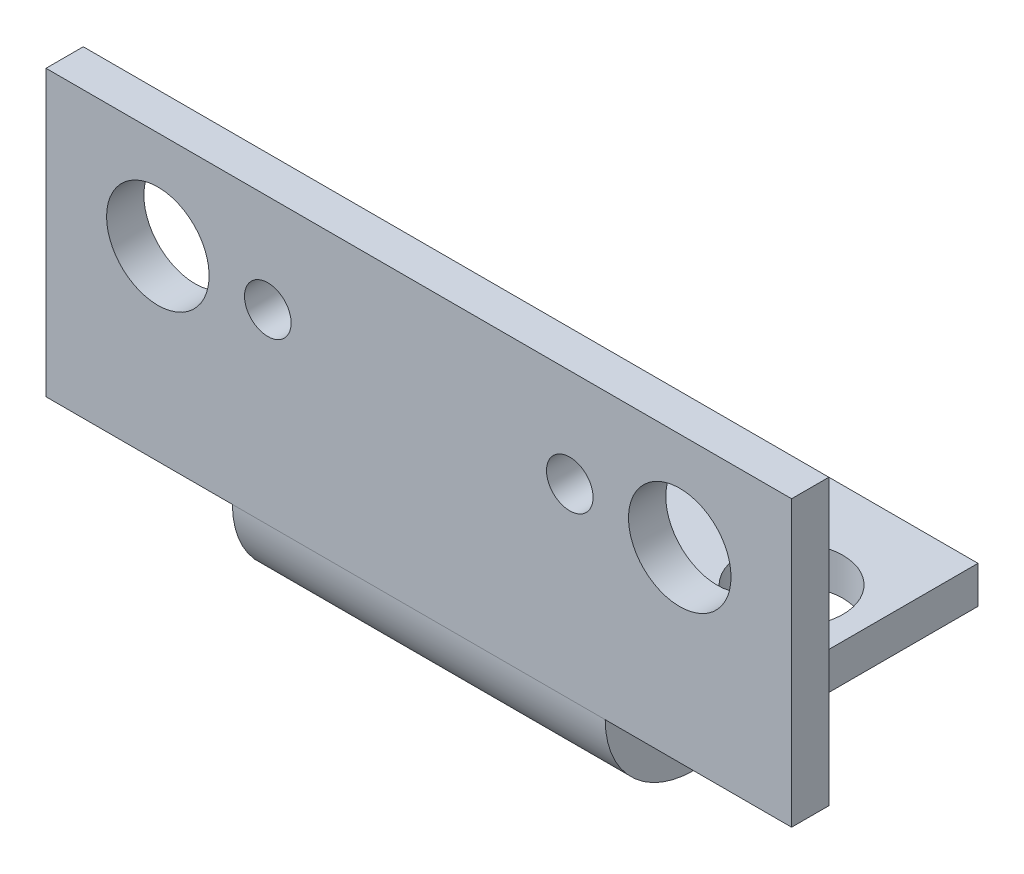
ISO-10303-21;
HEADER;
FILE_DESCRIPTION(('STEP AP214'),'2;1');
FILE_NAME('part.step','',(''),(''),'','','');
FILE_SCHEMA(('AUTOMOTIVE_DESIGN { 1 0 10303 214 1 1 1 1 }'));
ENDSEC;
DATA;
#1=APPLICATION_CONTEXT('core data for automotive mechanical design processes');
#2=APPLICATION_PROTOCOL_DEFINITION('international standard','automotive_design',2000,#1);
#3=PRODUCT_CONTEXT('',#1,'mechanical');
#4=PRODUCT('Part','Part','',(#3));
#5=PRODUCT_RELATED_PRODUCT_CATEGORY('part','',(#4));
#6=PRODUCT_DEFINITION_FORMATION('','',#4);
#7=PRODUCT_DEFINITION_CONTEXT('part definition',#1,'design');
#8=PRODUCT_DEFINITION('design','',#6,#7);
#9=PRODUCT_DEFINITION_SHAPE('','',#8);
#10=(LENGTH_UNIT() NAMED_UNIT(*) SI_UNIT(.MILLI.,.METRE.));
#11=(NAMED_UNIT(*) PLANE_ANGLE_UNIT() SI_UNIT($,.RADIAN.));
#12=(NAMED_UNIT(*) SI_UNIT($,.STERADIAN.) SOLID_ANGLE_UNIT());
#13=UNCERTAINTY_MEASURE_WITH_UNIT(LENGTH_MEASURE(1.E-05),#10,'distance_accuracy_value','');
#14=(GEOMETRIC_REPRESENTATION_CONTEXT(3) GLOBAL_UNCERTAINTY_ASSIGNED_CONTEXT((#13)) GLOBAL_UNIT_ASSIGNED_CONTEXT((#10,
#11,#12)) REPRESENTATION_CONTEXT('',''));
#15=CARTESIAN_POINT('',(0.,0.,0.));
#16=DIRECTION('',(0.,0.,1.));
#17=DIRECTION('',(1.,0.,0.));
#18=AXIS2_PLACEMENT_3D('',#15,#16,#17);
#19=CARTESIAN_POINT('',(10.,-2.,10.));
#20=DIRECTION('',(1.,0.,0.));
#21=DIRECTION('',(0.,0.,-1.));
#22=AXIS2_PLACEMENT_3D('',#19,#20,#21);
#23=PLANE('',#22);
#24=DIRECTION('',(0.,0.,-1.));
#25=VECTOR('',#24,1.);
#26=CARTESIAN_POINT('',(10.,0.,10.));
#27=LINE('',#26,#25);
#28=CARTESIAN_POINT('',(10.,0.,5.26340000000001));
#29=VERTEX_POINT('',#28);
#30=CARTESIAN_POINT('',(10.,0.,-10.));
#31=VERTEX_POINT('',#30);
#32=EDGE_CURVE('E111',#29,#31,#27,.T.);
#33=ORIENTED_EDGE('',*,*,#32,.F.);
#34=DIRECTION('',(0.,-1.,0.));
#35=VECTOR('',#34,1.);
#36=CARTESIAN_POINT('',(10.,0.,5.26340000000001));
#37=LINE('',#36,#35);
#38=CARTESIAN_POINT('',(10.,-2.00000000000001,5.26340000000001));
#39=VERTEX_POINT('',#38);
#40=EDGE_CURVE('E200',#29,#39,#37,.T.);
#41=ORIENTED_EDGE('',*,*,#40,.T.);
#42=DIRECTION('',(0.,0.,-1.));
#43=VECTOR('',#42,1.);
#44=CARTESIAN_POINT('',(10.,-2.,10.));
#45=LINE('',#44,#43);
#46=CARTESIAN_POINT('',(10.,-2.,-10.));
#47=VERTEX_POINT('',#46);
#48=EDGE_CURVE('E107',#39,#47,#45,.T.);
#49=ORIENTED_EDGE('',*,*,#48,.T.);
#50=DIRECTION('',(0.,1.,0.));
#51=VECTOR('',#50,1.);
#52=CARTESIAN_POINT('',(10.,-2.,-10.));
#53=LINE('',#52,#51);
#54=EDGE_CURVE('E65',#47,#31,#53,.T.);
#55=ORIENTED_EDGE('',*,*,#54,.T.);
#56=EDGE_LOOP('',(#33,#41,#49,#55));
#57=FACE_BOUND('',#56,.T.);
#58=ADVANCED_FACE('F57',(#57),#23,.T.);
#59=CARTESIAN_POINT('',(0.,-2.,0.));
#60=DIRECTION('',(0.,-1.,0.));
#61=DIRECTION('',(0.,0.,-1.));
#62=AXIS2_PLACEMENT_3D('',#59,#60,#61);
#63=PLANE('',#62);
#64=CARTESIAN_POINT('',(-6.,-2.,-4.));
#65=DIRECTION('',(0.,-1.,0.));
#66=DIRECTION('',(0.,0.,-1.));
#67=AXIS2_PLACEMENT_3D('',#64,#65,#66);
#68=CIRCLE('',#67,2.75);
#69=CARTESIAN_POINT('',(-6.,-2.,-6.75));
#70=VERTEX_POINT('',#69);
#71=EDGE_CURVE('E148',#70,#70,#68,.T.);
#72=ORIENTED_EDGE('',*,*,#71,.F.);
#73=EDGE_LOOP('',(#72));
#74=FACE_BOUND('',#73,.T.);
#75=CARTESIAN_POINT('',(6.,-2.,-4.));
#76=DIRECTION('',(0.,-1.,0.));
#77=DIRECTION('',(0.,0.,-1.));
#78=AXIS2_PLACEMENT_3D('',#75,#76,#77);
#79=CIRCLE('',#78,2.75);
#80=CARTESIAN_POINT('',(6.,-2.,-6.75));
#81=VERTEX_POINT('',#80);
#82=EDGE_CURVE('E137',#81,#81,#79,.T.);
#83=ORIENTED_EDGE('',*,*,#82,.F.);
#84=EDGE_LOOP('',(#83));
#85=FACE_BOUND('',#84,.T.);
#86=ORIENTED_EDGE('',*,*,#48,.F.);
#87=DIRECTION('',(1.,0.,0.));
#88=VECTOR('',#87,1.);
#89=CARTESIAN_POINT('',(10.,-2.00000000000001,5.26340000000001));
#90=LINE('',#89,#88);
#91=CARTESIAN_POINT('',(-9.99999999999999,-2.,5.26340000000001));
#92=VERTEX_POINT('',#91);
#93=EDGE_CURVE('E195',#39,#92,#90,.F.);
#94=ORIENTED_EDGE('',*,*,#93,.T.);
#95=DIRECTION('',(0.,0.,1.));
#96=VECTOR('',#95,1.);
#97=CARTESIAN_POINT('',(-9.99999999999999,-2.,10.));
#98=LINE('',#97,#96);
#99=CARTESIAN_POINT('',(-9.99999999999999,-2.,-10.));
#100=VERTEX_POINT('',#99);
#101=EDGE_CURVE('E119',#100,#92,#98,.T.);
#102=ORIENTED_EDGE('',*,*,#101,.F.);
#103=DIRECTION('',(-1.,0.,0.));
#104=VECTOR('',#103,1.);
#105=CARTESIAN_POINT('',(-9.99999999999999,-2.,-10.));
#106=LINE('',#105,#104);
#107=EDGE_CURVE('E98',#47,#100,#106,.T.);
#108=ORIENTED_EDGE('',*,*,#107,.F.);
#109=EDGE_LOOP('',(#86,#94,#102,#108));
#110=FACE_BOUND('',#109,.T.);
#111=ADVANCED_FACE('F228',(#74,#85,#110),#63,.T.);
#112=CARTESIAN_POINT('',(0.,0.,0.));
#113=DIRECTION('',(0.,-1.,0.));
#114=DIRECTION('',(0.,0.,-1.));
#115=AXIS2_PLACEMENT_3D('',#112,#113,#114);
#116=PLANE('',#115);
#117=CARTESIAN_POINT('',(-6.,0.,-4.));
#118=DIRECTION('',(0.,-1.,0.));
#119=DIRECTION('',(0.,0.,-1.));
#120=AXIS2_PLACEMENT_3D('',#117,#118,#119);
#121=CIRCLE('',#120,2.75);
#122=CARTESIAN_POINT('',(-6.,0.,-6.75));
#123=VERTEX_POINT('',#122);
#124=EDGE_CURVE('E60',#123,#123,#121,.T.);
#125=ORIENTED_EDGE('',*,*,#124,.T.);
#126=EDGE_LOOP('',(#125));
#127=FACE_BOUND('',#126,.T.);
#128=CARTESIAN_POINT('',(6.,0.,-4.));
#129=DIRECTION('',(0.,-1.,0.));
#130=DIRECTION('',(0.,0.,-1.));
#131=AXIS2_PLACEMENT_3D('',#128,#129,#130);
#132=CIRCLE('',#131,2.75);
#133=CARTESIAN_POINT('',(6.,0.,-6.75));
#134=VERTEX_POINT('',#133);
#135=EDGE_CURVE('E134',#134,#134,#132,.T.);
#136=ORIENTED_EDGE('',*,*,#135,.T.);
#137=EDGE_LOOP('',(#136));
#138=FACE_BOUND('',#137,.T.);
#139=DIRECTION('',(1.,0.,0.));
#140=VECTOR('',#139,1.);
#141=CARTESIAN_POINT('',(10.,0.,5.26340000000001));
#142=LINE('',#141,#140);
#143=CARTESIAN_POINT('',(-10.,0.,5.26340000000001));
#144=VERTEX_POINT('',#143);
#145=EDGE_CURVE('E209',#29,#144,#142,.F.);
#146=ORIENTED_EDGE('',*,*,#145,.F.);
#147=ORIENTED_EDGE('',*,*,#32,.T.);
#148=DIRECTION('',(-1.,0.,0.));
#149=VECTOR('',#148,1.);
#150=CARTESIAN_POINT('',(-9.99999999999999,0.,-10.));
#151=LINE('',#150,#149);
#152=CARTESIAN_POINT('',(-9.99999999999999,0.,-10.));
#153=VERTEX_POINT('',#152);
#154=EDGE_CURVE('E96',#31,#153,#151,.T.);
#155=ORIENTED_EDGE('',*,*,#154,.T.);
#156=DIRECTION('',(0.,0.,1.));
#157=VECTOR('',#156,1.);
#158=CARTESIAN_POINT('',(-9.99999999999999,0.,10.));
#159=LINE('',#158,#157);
#160=EDGE_CURVE('E101',#153,#144,#159,.T.);
#161=ORIENTED_EDGE('',*,*,#160,.T.);
#162=EDGE_LOOP('',(#146,#147,#155,#161));
#163=FACE_BOUND('',#162,.T.);
#164=ADVANCED_FACE('F109',(#127,#138,#163),#116,.F.);
#165=CARTESIAN_POINT('',(-9.99999999999999,-2.,10.));
#166=DIRECTION('',(-1.,0.,0.));
#167=DIRECTION('',(0.,0.,1.));
#168=AXIS2_PLACEMENT_3D('',#165,#166,#167);
#169=PLANE('',#168);
#170=DIRECTION('',(0.,-1.,0.));
#171=VECTOR('',#170,1.);
#172=CARTESIAN_POINT('',(-10.,0.,5.26340000000001));
#173=LINE('',#172,#171);
#174=EDGE_CURVE('E104',#144,#92,#173,.T.);
#175=ORIENTED_EDGE('',*,*,#174,.F.);
#176=ORIENTED_EDGE('',*,*,#160,.F.);
#177=DIRECTION('',(0.,1.,0.));
#178=VECTOR('',#177,1.);
#179=CARTESIAN_POINT('',(-9.99999999999999,-2.,-10.));
#180=LINE('',#179,#178);
#181=EDGE_CURVE('E13',#100,#153,#180,.T.);
#182=ORIENTED_EDGE('',*,*,#181,.F.);
#183=ORIENTED_EDGE('',*,*,#101,.T.);
#184=EDGE_LOOP('',(#175,#176,#182,#183));
#185=FACE_BOUND('',#184,.T.);
#186=ADVANCED_FACE('F102',(#185),#169,.T.);
#187=CARTESIAN_POINT('',(-9.99999999999999,-2.,-10.));
#188=DIRECTION('',(0.,0.,-1.));
#189=DIRECTION('',(-1.,0.,0.));
#190=AXIS2_PLACEMENT_3D('',#187,#188,#189);
#191=PLANE('',#190);
#192=ORIENTED_EDGE('',*,*,#154,.F.);
#193=ORIENTED_EDGE('',*,*,#54,.F.);
#194=ORIENTED_EDGE('',*,*,#107,.T.);
#195=ORIENTED_EDGE('',*,*,#181,.T.);
#196=EDGE_LOOP('',(#192,#193,#194,#195));
#197=FACE_BOUND('',#196,.T.);
#198=ADVANCED_FACE('F93',(#197),#191,.T.);
#199=CARTESIAN_POINT('',(-10.,2.73659999999999,5.26340000000001));
#200=DIRECTION('',(-1.,0.,0.));
#201=DIRECTION('',(0.,-1.,0.));
#202=AXIS2_PLACEMENT_3D('',#199,#200,#201);
#203=PLANE('',#202);
#204=DIRECTION('',(0.,0.,1.));
#205=VECTOR('',#204,1.);
#206=CARTESIAN_POINT('',(-10.,2.73659999999998,8.00000000000001));
#207=LINE('',#206,#205);
#208=CARTESIAN_POINT('',(-10.,2.73659999999998,8.00000000000001));
#209=VERTEX_POINT('',#208);
#210=CARTESIAN_POINT('',(-10.,2.73659999999999,10.));
#211=VERTEX_POINT('',#210);
#212=EDGE_CURVE('E218',#209,#211,#207,.T.);
#213=ORIENTED_EDGE('',*,*,#212,.F.);
#214=CARTESIAN_POINT('',(-10.,2.73659999999999,5.26340000000001));
#215=DIRECTION('',(1.,0.,0.));
#216=DIRECTION('',(0.,1.,0.));
#217=AXIS2_PLACEMENT_3D('',#214,#215,#216);
#218=CIRCLE('',#217,2.7366);
#219=EDGE_CURVE('E204',#144,#209,#218,.F.);
#220=ORIENTED_EDGE('',*,*,#219,.F.);
#221=ORIENTED_EDGE('',*,*,#174,.T.);
#222=CARTESIAN_POINT('',(-10.,2.73659999999999,5.26340000000001));
#223=DIRECTION('',(1.,0.,0.));
#224=DIRECTION('',(0.,1.,0.));
#225=AXIS2_PLACEMENT_3D('',#222,#223,#224);
#226=CIRCLE('',#225,4.7366);
#227=EDGE_CURVE('E73',#92,#211,#226,.F.);
#228=ORIENTED_EDGE('',*,*,#227,.T.);
#229=EDGE_LOOP('',(#213,#220,#221,#228));
#230=FACE_BOUND('',#229,.T.);
#231=ADVANCED_FACE('F327',(#230),#203,.T.);
#232=CARTESIAN_POINT('',(10.,2.73659999999999,5.26340000000001));
#233=DIRECTION('',(-1.,0.,0.));
#234=DIRECTION('',(0.,-1.,0.));
#235=AXIS2_PLACEMENT_3D('',#232,#233,#234);
#236=PLANE('',#235);
#237=CARTESIAN_POINT('',(10.,2.73659999999999,5.26340000000001));
#238=DIRECTION('',(1.,0.,0.));
#239=DIRECTION('',(0.,1.,0.));
#240=AXIS2_PLACEMENT_3D('',#237,#238,#239);
#241=CIRCLE('',#240,2.7366);
#242=CARTESIAN_POINT('',(10.,2.73659999999998,8.00000000000001));
#243=VERTEX_POINT('',#242);
#244=EDGE_CURVE('E212',#243,#29,#241,.T.);
#245=ORIENTED_EDGE('',*,*,#244,.F.);
#246=DIRECTION('',(0.,0.,1.));
#247=VECTOR('',#246,1.);
#248=CARTESIAN_POINT('',(10.,2.73659999999998,8.00000000000001));
#249=LINE('',#248,#247);
#250=CARTESIAN_POINT('',(10.,2.73659999999997,10.));
#251=VERTEX_POINT('',#250);
#252=EDGE_CURVE('E114',#243,#251,#249,.T.);
#253=ORIENTED_EDGE('',*,*,#252,.T.);
#254=CARTESIAN_POINT('',(10.,2.73659999999999,5.26340000000001));
#255=DIRECTION('',(1.,0.,0.));
#256=DIRECTION('',(0.,1.,0.));
#257=AXIS2_PLACEMENT_3D('',#254,#255,#256);
#258=CIRCLE('',#257,4.7366);
#259=EDGE_CURVE('E198',#251,#39,#258,.T.);
#260=ORIENTED_EDGE('',*,*,#259,.T.);
#261=ORIENTED_EDGE('',*,*,#40,.F.);
#262=EDGE_LOOP('',(#245,#253,#260,#261));
#263=FACE_BOUND('',#262,.T.);
#264=ADVANCED_FACE('F237',(#263),#236,.F.);
#265=CARTESIAN_POINT('',(10.,2.73659999999999,5.26340000000001));
#266=DIRECTION('',(1.,0.,0.));
#267=DIRECTION('',(0.,0.,1.));
#268=AXIS2_PLACEMENT_3D('',#265,#266,#267);
#269=CYLINDRICAL_SURFACE('',#268,4.7366);
#270=ORIENTED_EDGE('',*,*,#93,.F.);
#271=ORIENTED_EDGE('',*,*,#259,.F.);
#272=DIRECTION('',(1.,0.,0.));
#273=VECTOR('',#272,1.);
#274=CARTESIAN_POINT('',(10.,2.73659999999997,10.));
#275=LINE('',#274,#273);
#276=EDGE_CURVE('E201',#211,#251,#275,.T.);
#277=ORIENTED_EDGE('',*,*,#276,.F.);
#278=ORIENTED_EDGE('',*,*,#227,.F.);
#279=EDGE_LOOP('',(#270,#271,#277,#278));
#280=FACE_BOUND('',#279,.T.);
#281=ADVANCED_FACE('F230',(#280),#269,.T.);
#282=CARTESIAN_POINT('',(10.,2.73659999999999,5.26340000000001));
#283=DIRECTION('',(1.,0.,0.));
#284=DIRECTION('',(0.,0.,1.));
#285=AXIS2_PLACEMENT_3D('',#282,#283,#284);
#286=CYLINDRICAL_SURFACE('',#285,2.7366);
#287=ORIENTED_EDGE('',*,*,#145,.T.);
#288=ORIENTED_EDGE('',*,*,#219,.T.);
#289=DIRECTION('',(1.,0.,0.));
#290=VECTOR('',#289,1.);
#291=CARTESIAN_POINT('',(10.,2.73659999999998,8.00000000000001));
#292=LINE('',#291,#290);
#293=EDGE_CURVE('E160',#209,#243,#292,.T.);
#294=ORIENTED_EDGE('',*,*,#293,.T.);
#295=ORIENTED_EDGE('',*,*,#244,.T.);
#296=EDGE_LOOP('',(#287,#288,#294,#295));
#297=FACE_BOUND('',#296,.T.);
#298=ADVANCED_FACE('F335',(#297),#286,.F.);
#299=CARTESIAN_POINT('',(-20.,2.73659999999999,8.00000000000001));
#300=DIRECTION('',(0.,-1.,0.));
#301=DIRECTION('',(1.,0.,0.));
#302=AXIS2_PLACEMENT_3D('',#299,#300,#301);
#303=PLANE('',#302);
#304=ORIENTED_EDGE('',*,*,#252,.F.);
#305=DIRECTION('',(-1.,0.,0.));
#306=VECTOR('',#305,1.);
#307=CARTESIAN_POINT('',(-20.,2.73659999999999,8.00000000000001));
#308=LINE('',#307,#306);
#309=CARTESIAN_POINT('',(20.,2.73659999999999,8.00000000000001));
#310=VERTEX_POINT('',#309);
#311=EDGE_CURVE('E192',#243,#310,#308,.F.);
#312=ORIENTED_EDGE('',*,*,#311,.T.);
#313=DIRECTION('',(0.,0.,1.));
#314=VECTOR('',#313,1.);
#315=CARTESIAN_POINT('',(20.,2.73659999999999,8.00000000000001));
#316=LINE('',#315,#314);
#317=CARTESIAN_POINT('',(20.,2.73659999999999,10.));
#318=VERTEX_POINT('',#317);
#319=EDGE_CURVE('E186',#310,#318,#316,.T.);
#320=ORIENTED_EDGE('',*,*,#319,.T.);
#321=DIRECTION('',(1.,0.,0.));
#322=VECTOR('',#321,1.);
#323=CARTESIAN_POINT('',(0.,2.73659999999999,10.));
#324=LINE('',#323,#322);
#325=EDGE_CURVE('E185',#251,#318,#324,.T.);
#326=ORIENTED_EDGE('',*,*,#325,.F.);
#327=EDGE_LOOP('',(#304,#312,#320,#326));
#328=FACE_BOUND('',#327,.T.);
#329=ADVANCED_FACE('F282',(#328),#303,.T.);
#330=CARTESIAN_POINT('',(20.,0.,10.));
#331=DIRECTION('',(1.,0.,0.));
#332=DIRECTION('',(0.,0.,-1.));
#333=AXIS2_PLACEMENT_3D('',#330,#331,#332);
#334=PLANE('',#333);
#335=DIRECTION('',(0.,-1.,0.));
#336=VECTOR('',#335,1.);
#337=CARTESIAN_POINT('',(20.,0.,10.));
#338=LINE('',#337,#336);
#339=CARTESIAN_POINT('',(20.,18.,10.0000000000001));
#340=VERTEX_POINT('',#339);
#341=EDGE_CURVE('E164',#340,#318,#338,.T.);
#342=ORIENTED_EDGE('',*,*,#341,.T.);
#343=ORIENTED_EDGE('',*,*,#319,.F.);
#344=DIRECTION('',(0.,1.,0.));
#345=VECTOR('',#344,1.);
#346=CARTESIAN_POINT('',(20.,0.,8.));
#347=LINE('',#346,#345);
#348=CARTESIAN_POINT('',(20.,18.,8.00000000000006));
#349=VERTEX_POINT('',#348);
#350=EDGE_CURVE('E173',#349,#310,#347,.F.);
#351=ORIENTED_EDGE('',*,*,#350,.F.);
#352=DIRECTION('',(0.,0.,-1.));
#353=VECTOR('',#352,1.);
#354=CARTESIAN_POINT('',(20.,18.,10.0000000000001));
#355=LINE('',#354,#353);
#356=EDGE_CURVE('E157',#340,#349,#355,.T.);
#357=ORIENTED_EDGE('',*,*,#356,.F.);
#358=EDGE_LOOP('',(#342,#343,#351,#357));
#359=FACE_BOUND('',#358,.T.);
#360=ADVANCED_FACE('F280',(#359),#334,.T.);
#361=CARTESIAN_POINT('',(-20.,18.,10.0000000000001));
#362=DIRECTION('',(-1.,0.,0.));
#363=DIRECTION('',(0.,-1.,0.));
#364=AXIS2_PLACEMENT_3D('',#361,#362,#363);
#365=PLANE('',#364);
#366=DIRECTION('',(0.,-1.,0.));
#367=VECTOR('',#366,1.);
#368=CARTESIAN_POINT('',(-20.,0.,8.));
#369=LINE('',#368,#367);
#370=CARTESIAN_POINT('',(-20.,2.73659999999999,8.00000000000001));
#371=VERTEX_POINT('',#370);
#372=CARTESIAN_POINT('',(-20.,18.,8.00000000000006));
#373=VERTEX_POINT('',#372);
#374=EDGE_CURVE('E179',#371,#373,#369,.F.);
#375=ORIENTED_EDGE('',*,*,#374,.F.);
#376=DIRECTION('',(0.,0.,1.));
#377=VECTOR('',#376,1.);
#378=CARTESIAN_POINT('',(-20.,2.73659999999999,10.0000000000001));
#379=LINE('',#378,#377);
#380=CARTESIAN_POINT('',(-20.,2.73659999999999,10.));
#381=VERTEX_POINT('',#380);
#382=EDGE_CURVE('E123',#371,#381,#379,.T.);
#383=ORIENTED_EDGE('',*,*,#382,.T.);
#384=DIRECTION('',(0.,1.,0.));
#385=VECTOR('',#384,1.);
#386=CARTESIAN_POINT('',(-20.,18.,10.0000000000001));
#387=LINE('',#386,#385);
#388=CARTESIAN_POINT('',(-20.,18.,10.0000000000001));
#389=VERTEX_POINT('',#388);
#390=EDGE_CURVE('E170',#381,#389,#387,.T.);
#391=ORIENTED_EDGE('',*,*,#390,.T.);
#392=DIRECTION('',(0.,0.,-1.));
#393=VECTOR('',#392,1.);
#394=CARTESIAN_POINT('',(-20.,18.,10.0000000000001));
#395=LINE('',#394,#393);
#396=EDGE_CURVE('E161',#389,#373,#395,.T.);
#397=ORIENTED_EDGE('',*,*,#396,.T.);
#398=EDGE_LOOP('',(#375,#383,#391,#397));
#399=FACE_BOUND('',#398,.T.);
#400=ADVANCED_FACE('F297',(#399),#365,.T.);
#401=CARTESIAN_POINT('',(0.,0.,10.));
#402=DIRECTION('',(0.,0.,1.));
#403=DIRECTION('',(0.,-1.,0.));
#404=AXIS2_PLACEMENT_3D('',#401,#402,#403);
#405=PLANE('',#404);
#406=CARTESIAN_POINT('',(8.1,12.7366,10.));
#407=DIRECTION('',(0.,0.,1.));
#408=DIRECTION('',(1.,0.,0.));
#409=AXIS2_PLACEMENT_3D('',#406,#407,#408);
#410=CIRCLE('',#409,1.25);
#411=CARTESIAN_POINT('',(9.35,12.7366,10.));
#412=VERTEX_POINT('',#411);
#413=EDGE_CURVE('E129',#412,#412,#410,.T.);
#414=ORIENTED_EDGE('',*,*,#413,.F.);
#415=EDGE_LOOP('',(#414));
#416=FACE_BOUND('',#415,.T.);
#417=CARTESIAN_POINT('',(-8.1,12.7366,10.));
#418=DIRECTION('',(0.,0.,1.));
#419=DIRECTION('',(-1.,0.,0.));
#420=AXIS2_PLACEMENT_3D('',#417,#418,#419);
#421=CIRCLE('',#420,1.25);
#422=CARTESIAN_POINT('',(-9.35,12.7366,10.));
#423=VERTEX_POINT('',#422);
#424=EDGE_CURVE('E141',#423,#423,#421,.T.);
#425=ORIENTED_EDGE('',*,*,#424,.F.);
#426=EDGE_LOOP('',(#425));
#427=FACE_BOUND('',#426,.T.);
#428=CARTESIAN_POINT('',(-14.,12.7366,10.));
#429=DIRECTION('',(0.,0.,1.));
#430=DIRECTION('',(-1.,0.,0.));
#431=AXIS2_PLACEMENT_3D('',#428,#429,#430);
#432=CIRCLE('',#431,2.75);
#433=CARTESIAN_POINT('',(-16.75,12.7366,10.));
#434=VERTEX_POINT('',#433);
#435=EDGE_CURVE('E136',#434,#434,#432,.T.);
#436=ORIENTED_EDGE('',*,*,#435,.F.);
#437=EDGE_LOOP('',(#436));
#438=FACE_BOUND('',#437,.T.);
#439=CARTESIAN_POINT('',(14.,12.7366,10.));
#440=DIRECTION('',(0.,0.,1.));
#441=DIRECTION('',(1.,0.,0.));
#442=AXIS2_PLACEMENT_3D('',#439,#440,#441);
#443=CIRCLE('',#442,2.75);
#444=CARTESIAN_POINT('',(16.75,12.7366,10.));
#445=VERTEX_POINT('',#444);
#446=EDGE_CURVE('E124',#445,#445,#443,.T.);
#447=ORIENTED_EDGE('',*,*,#446,.F.);
#448=EDGE_LOOP('',(#447));
#449=FACE_BOUND('',#448,.T.);
#450=ORIENTED_EDGE('',*,*,#390,.F.);
#451=EDGE_CURVE('E182',#381,#211,#324,.T.);
#452=ORIENTED_EDGE('',*,*,#451,.T.);
#453=ORIENTED_EDGE('',*,*,#276,.T.);
#454=ORIENTED_EDGE('',*,*,#325,.T.);
#455=ORIENTED_EDGE('',*,*,#341,.F.);
#456=DIRECTION('',(1.,0.,0.));
#457=VECTOR('',#456,1.);
#458=CARTESIAN_POINT('',(20.,18.,10.0000000000001));
#459=LINE('',#458,#457);
#460=EDGE_CURVE('E167',#389,#340,#459,.T.);
#461=ORIENTED_EDGE('',*,*,#460,.F.);
#462=EDGE_LOOP('',(#450,#452,#453,#454,#455,#461));
#463=FACE_BOUND('',#462,.T.);
#464=ADVANCED_FACE('F275',(#416,#427,#438,#449,#463),#405,.T.);
#465=CARTESIAN_POINT('',(0.,0.,8.));
#466=DIRECTION('',(0.,0.,1.));
#467=DIRECTION('',(0.,-1.,0.));
#468=AXIS2_PLACEMENT_3D('',#465,#466,#467);
#469=PLANE('',#468);
#470=CARTESIAN_POINT('',(8.1,12.7366,8.00000000000004));
#471=DIRECTION('',(0.,0.,1.));
#472=DIRECTION('',(0.,-1.,0.));
#473=AXIS2_PLACEMENT_3D('',#470,#471,#472);
#474=CIRCLE('',#473,1.25);
#475=CARTESIAN_POINT('',(8.1,11.4866,8.00000000000004));
#476=VERTEX_POINT('',#475);
#477=EDGE_CURVE('E132',#476,#476,#474,.T.);
#478=ORIENTED_EDGE('',*,*,#477,.T.);
#479=EDGE_LOOP('',(#478));
#480=FACE_BOUND('',#479,.T.);
#481=CARTESIAN_POINT('',(-8.1,12.7366,8.00000000000004));
#482=DIRECTION('',(0.,0.,1.));
#483=DIRECTION('',(0.,-1.,0.));
#484=AXIS2_PLACEMENT_3D('',#481,#482,#483);
#485=CIRCLE('',#484,1.25);
#486=CARTESIAN_POINT('',(-8.1,11.4866,8.00000000000004));
#487=VERTEX_POINT('',#486);
#488=EDGE_CURVE('E128',#487,#487,#485,.T.);
#489=ORIENTED_EDGE('',*,*,#488,.T.);
#490=EDGE_LOOP('',(#489));
#491=FACE_BOUND('',#490,.T.);
#492=CARTESIAN_POINT('',(-14.,12.7366,8.00000000000004));
#493=DIRECTION('',(0.,0.,1.));
#494=DIRECTION('',(0.,-1.,0.));
#495=AXIS2_PLACEMENT_3D('',#492,#493,#494);
#496=CIRCLE('',#495,2.75);
#497=CARTESIAN_POINT('',(-14.,9.98659999999998,8.00000000000004));
#498=VERTEX_POINT('',#497);
#499=EDGE_CURVE('E125',#498,#498,#496,.T.);
#500=ORIENTED_EDGE('',*,*,#499,.T.);
#501=EDGE_LOOP('',(#500));
#502=FACE_BOUND('',#501,.T.);
#503=CARTESIAN_POINT('',(14.,12.7366,8.00000000000004));
#504=DIRECTION('',(0.,0.,1.));
#505=DIRECTION('',(0.,-1.,0.));
#506=AXIS2_PLACEMENT_3D('',#503,#504,#505);
#507=CIRCLE('',#506,2.75);
#508=CARTESIAN_POINT('',(14.,9.98659999999998,8.00000000000004));
#509=VERTEX_POINT('',#508);
#510=EDGE_CURVE('E120',#509,#509,#507,.T.);
#511=ORIENTED_EDGE('',*,*,#510,.T.);
#512=EDGE_LOOP('',(#511));
#513=FACE_BOUND('',#512,.T.);
#514=EDGE_CURVE('E189',#371,#209,#308,.F.);
#515=ORIENTED_EDGE('',*,*,#514,.F.);
#516=ORIENTED_EDGE('',*,*,#374,.T.);
#517=DIRECTION('',(-1.,0.,0.));
#518=VECTOR('',#517,1.);
#519=CARTESIAN_POINT('',(0.,18.,8.00000000000006));
#520=LINE('',#519,#518);
#521=EDGE_CURVE('E176',#373,#349,#520,.F.);
#522=ORIENTED_EDGE('',*,*,#521,.T.);
#523=ORIENTED_EDGE('',*,*,#350,.T.);
#524=ORIENTED_EDGE('',*,*,#311,.F.);
#525=ORIENTED_EDGE('',*,*,#293,.F.);
#526=EDGE_LOOP('',(#515,#516,#522,#523,#524,#525));
#527=FACE_BOUND('',#526,.T.);
#528=ADVANCED_FACE('F286',(#480,#491,#502,#513,#527),#469,.F.);
#529=CARTESIAN_POINT('',(20.,18.,10.0000000000001));
#530=DIRECTION('',(0.,1.,0.));
#531=DIRECTION('',(0.,0.,1.));
#532=AXIS2_PLACEMENT_3D('',#529,#530,#531);
#533=PLANE('',#532);
#534=ORIENTED_EDGE('',*,*,#521,.F.);
#535=ORIENTED_EDGE('',*,*,#396,.F.);
#536=ORIENTED_EDGE('',*,*,#460,.T.);
#537=ORIENTED_EDGE('',*,*,#356,.T.);
#538=EDGE_LOOP('',(#534,#535,#536,#537));
#539=FACE_BOUND('',#538,.T.);
#540=ADVANCED_FACE('F291',(#539),#533,.T.);
#541=ORIENTED_EDGE('',*,*,#514,.T.);
#542=ORIENTED_EDGE('',*,*,#212,.T.);
#543=ORIENTED_EDGE('',*,*,#451,.F.);
#544=ORIENTED_EDGE('',*,*,#382,.F.);
#545=EDGE_LOOP('',(#541,#542,#543,#544));
#546=FACE_BOUND('',#545,.T.);
#547=ADVANCED_FACE('F296',(#546),#303,.T.);
#548=CARTESIAN_POINT('',(14.,12.7366,0.));
#549=DIRECTION('',(0.,0.,1.));
#550=DIRECTION('',(1.,0.,0.));
#551=AXIS2_PLACEMENT_3D('',#548,#549,#550);
#552=CYLINDRICAL_SURFACE('',#551,2.75);
#553=ORIENTED_EDGE('',*,*,#446,.T.);
#554=EDGE_LOOP('',(#553));
#555=FACE_BOUND('',#554,.T.);
#556=ORIENTED_EDGE('',*,*,#510,.F.);
#557=EDGE_LOOP('',(#556));
#558=FACE_BOUND('',#557,.T.);
#559=ADVANCED_FACE('F383',(#555,#558),#552,.F.);
#560=CARTESIAN_POINT('',(-14.,12.7366,0.));
#561=DIRECTION('',(0.,0.,1.));
#562=DIRECTION('',(1.,0.,0.));
#563=AXIS2_PLACEMENT_3D('',#560,#561,#562);
#564=CYLINDRICAL_SURFACE('',#563,2.75);
#565=ORIENTED_EDGE('',*,*,#435,.T.);
#566=EDGE_LOOP('',(#565));
#567=FACE_BOUND('',#566,.T.);
#568=ORIENTED_EDGE('',*,*,#499,.F.);
#569=EDGE_LOOP('',(#568));
#570=FACE_BOUND('',#569,.T.);
#571=ADVANCED_FACE('F406',(#567,#570),#564,.F.);
#572=CARTESIAN_POINT('',(-8.1,12.7366,0.));
#573=DIRECTION('',(0.,0.,1.));
#574=DIRECTION('',(1.,0.,0.));
#575=AXIS2_PLACEMENT_3D('',#572,#573,#574);
#576=CYLINDRICAL_SURFACE('',#575,1.25);
#577=ORIENTED_EDGE('',*,*,#424,.T.);
#578=EDGE_LOOP('',(#577));
#579=FACE_BOUND('',#578,.T.);
#580=ORIENTED_EDGE('',*,*,#488,.F.);
#581=EDGE_LOOP('',(#580));
#582=FACE_BOUND('',#581,.T.);
#583=ADVANCED_FACE('F417',(#579,#582),#576,.F.);
#584=CARTESIAN_POINT('',(8.1,12.7366,0.));
#585=DIRECTION('',(0.,0.,1.));
#586=DIRECTION('',(1.,0.,0.));
#587=AXIS2_PLACEMENT_3D('',#584,#585,#586);
#588=CYLINDRICAL_SURFACE('',#587,1.25);
#589=ORIENTED_EDGE('',*,*,#413,.T.);
#590=EDGE_LOOP('',(#589));
#591=FACE_BOUND('',#590,.T.);
#592=ORIENTED_EDGE('',*,*,#477,.F.);
#593=EDGE_LOOP('',(#592));
#594=FACE_BOUND('',#593,.T.);
#595=ADVANCED_FACE('F428',(#591,#594),#588,.F.);
#596=CARTESIAN_POINT('',(6.,8.,-4.));
#597=DIRECTION('',(0.,-1.,0.));
#598=DIRECTION('',(0.,0.,-1.));
#599=AXIS2_PLACEMENT_3D('',#596,#597,#598);
#600=CYLINDRICAL_SURFACE('',#599,2.75);
#601=ORIENTED_EDGE('',*,*,#82,.T.);
#602=EDGE_LOOP('',(#601));
#603=FACE_BOUND('',#602,.T.);
#604=ORIENTED_EDGE('',*,*,#135,.F.);
#605=EDGE_LOOP('',(#604));
#606=FACE_BOUND('',#605,.T.);
#607=ADVANCED_FACE('F438',(#603,#606),#600,.F.);
#608=CARTESIAN_POINT('',(-6.,8.,-4.));
#609=DIRECTION('',(0.,-1.,0.));
#610=DIRECTION('',(0.,0.,-1.));
#611=AXIS2_PLACEMENT_3D('',#608,#609,#610);
#612=CYLINDRICAL_SURFACE('',#611,2.75);
#613=ORIENTED_EDGE('',*,*,#71,.T.);
#614=EDGE_LOOP('',(#613));
#615=FACE_BOUND('',#614,.T.);
#616=ORIENTED_EDGE('',*,*,#124,.F.);
#617=EDGE_LOOP('',(#616));
#618=FACE_BOUND('',#617,.T.);
#619=ADVANCED_FACE('F462',(#615,#618),#612,.F.);
#620=CLOSED_SHELL('',(#58,#111,#164,#186,#198,#231,#264,#281,#298,#329,#360,#400,#464,#528,#540,
#547,#559,#571,#583,#595,#607,#619));
#621=MANIFOLD_SOLID_BREP('B2',#620);
#622=ADVANCED_BREP_SHAPE_REPRESENTATION('',(#18,#621),#14);
#623=SHAPE_DEFINITION_REPRESENTATION(#9,#622);
ENDSEC;
END-ISO-10303-21;
